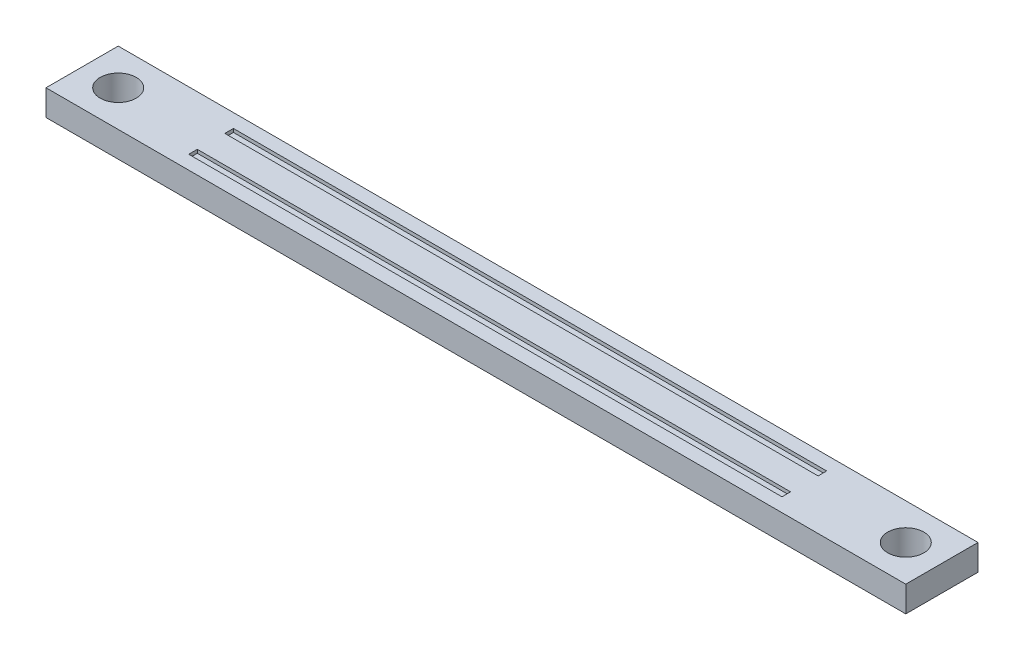
ISO-10303-21;
HEADER;
FILE_DESCRIPTION(('STEP AP214'),'2;1');
FILE_NAME('part.step','',(''),(''),'','','');
FILE_SCHEMA(('AUTOMOTIVE_DESIGN { 1 0 10303 214 1 1 1 1 }'));
ENDSEC;
DATA;
#1=APPLICATION_CONTEXT('core data for automotive mechanical design processes');
#2=APPLICATION_PROTOCOL_DEFINITION('international standard','automotive_design',2000,#1);
#3=PRODUCT_CONTEXT('',#1,'mechanical');
#4=PRODUCT('Part','Part','',(#3));
#5=PRODUCT_RELATED_PRODUCT_CATEGORY('part','',(#4));
#6=PRODUCT_DEFINITION_FORMATION('','',#4);
#7=PRODUCT_DEFINITION_CONTEXT('part definition',#1,'design');
#8=PRODUCT_DEFINITION('design','',#6,#7);
#9=PRODUCT_DEFINITION_SHAPE('','',#8);
#10=(LENGTH_UNIT() NAMED_UNIT(*) SI_UNIT(.MILLI.,.METRE.));
#11=(NAMED_UNIT(*) PLANE_ANGLE_UNIT() SI_UNIT($,.RADIAN.));
#12=(NAMED_UNIT(*) SI_UNIT($,.STERADIAN.) SOLID_ANGLE_UNIT());
#13=UNCERTAINTY_MEASURE_WITH_UNIT(LENGTH_MEASURE(1.E-05),#10,'distance_accuracy_value','');
#14=(GEOMETRIC_REPRESENTATION_CONTEXT(3) GLOBAL_UNCERTAINTY_ASSIGNED_CONTEXT((#13)) GLOBAL_UNIT_ASSIGNED_CONTEXT((#10,
#11,#12)) REPRESENTATION_CONTEXT('',''));
#15=CARTESIAN_POINT('',(0.,0.,0.));
#16=DIRECTION('',(0.,0.,1.));
#17=DIRECTION('',(1.,0.,0.));
#18=AXIS2_PLACEMENT_3D('',#15,#16,#17);
#19=CARTESIAN_POINT('',(-260.,15.,-21.));
#20=DIRECTION('',(0.,0.,1.));
#21=DIRECTION('',(1.,0.,0.));
#22=AXIS2_PLACEMENT_3D('',#19,#20,#21);
#23=PLANE('',#22);
#24=DIRECTION('',(-1.,0.,0.));
#25=VECTOR('',#24,1.);
#26=CARTESIAN_POINT('',(-260.,0.,-21.));
#27=LINE('',#26,#25);
#28=CARTESIAN_POINT('',(250.,0.,-21.));
#29=VERTEX_POINT('',#28);
#30=CARTESIAN_POINT('',(-250.,0.,-21.));
#31=VERTEX_POINT('',#30);
#32=EDGE_CURVE('E219',#29,#31,#27,.T.);
#33=ORIENTED_EDGE('',*,*,#32,.T.);
#34=DIRECTION('',(0.,1.,0.));
#35=VECTOR('',#34,1.);
#36=CARTESIAN_POINT('',(-250.,0.,-21.));
#37=LINE('',#36,#35);
#38=CARTESIAN_POINT('',(-250.,15.,-21.));
#39=VERTEX_POINT('',#38);
#40=EDGE_CURVE('E203',#31,#39,#37,.T.);
#41=ORIENTED_EDGE('',*,*,#40,.T.);
#42=DIRECTION('',(-1.,0.,0.));
#43=VECTOR('',#42,1.);
#44=CARTESIAN_POINT('',(-260.,15.,-21.));
#45=LINE('',#44,#43);
#46=CARTESIAN_POINT('',(250.,15.,-21.));
#47=VERTEX_POINT('',#46);
#48=EDGE_CURVE('E45',#47,#39,#45,.T.);
#49=ORIENTED_EDGE('',*,*,#48,.F.);
#50=DIRECTION('',(0.,1.,0.));
#51=VECTOR('',#50,1.);
#52=CARTESIAN_POINT('',(250.,0.,-21.));
#53=LINE('',#52,#51);
#54=EDGE_CURVE('E208',#29,#47,#53,.T.);
#55=ORIENTED_EDGE('',*,*,#54,.F.);
#56=EDGE_LOOP('',(#33,#41,#49,#55));
#57=FACE_BOUND('',#56,.T.);
#58=ADVANCED_FACE('F37',(#57),#23,.F.);
#59=CARTESIAN_POINT('',(-260.,15.,21.));
#60=DIRECTION('',(0.,0.,-1.));
#61=DIRECTION('',(-1.,0.,0.));
#62=AXIS2_PLACEMENT_3D('',#59,#60,#61);
#63=PLANE('',#62);
#64=DIRECTION('',(1.,0.,0.));
#65=VECTOR('',#64,1.);
#66=CARTESIAN_POINT('',(-260.,15.,21.));
#67=LINE('',#66,#65);
#68=CARTESIAN_POINT('',(-250.,15.,21.));
#69=VERTEX_POINT('',#68);
#70=CARTESIAN_POINT('',(250.,15.,21.));
#71=VERTEX_POINT('',#70);
#72=EDGE_CURVE('E11',#69,#71,#67,.T.);
#73=ORIENTED_EDGE('',*,*,#72,.F.);
#74=DIRECTION('',(0.,1.,0.));
#75=VECTOR('',#74,1.);
#76=CARTESIAN_POINT('',(-250.,0.,21.));
#77=LINE('',#76,#75);
#78=CARTESIAN_POINT('',(-250.,0.,21.));
#79=VERTEX_POINT('',#78);
#80=EDGE_CURVE('E199',#79,#69,#77,.T.);
#81=ORIENTED_EDGE('',*,*,#80,.F.);
#82=DIRECTION('',(1.,0.,0.));
#83=VECTOR('',#82,1.);
#84=CARTESIAN_POINT('',(-260.,0.,21.));
#85=LINE('',#84,#83);
#86=CARTESIAN_POINT('',(250.,0.,21.));
#87=VERTEX_POINT('',#86);
#88=EDGE_CURVE('E40',#79,#87,#85,.T.);
#89=ORIENTED_EDGE('',*,*,#88,.T.);
#90=DIRECTION('',(0.,1.,0.));
#91=VECTOR('',#90,1.);
#92=CARTESIAN_POINT('',(250.,0.,21.));
#93=LINE('',#92,#91);
#94=EDGE_CURVE('E163',#87,#71,#93,.T.);
#95=ORIENTED_EDGE('',*,*,#94,.T.);
#96=EDGE_LOOP('',(#73,#81,#89,#95));
#97=FACE_BOUND('',#96,.T.);
#98=ADVANCED_FACE('F238',(#97),#63,.F.);
#99=CARTESIAN_POINT('',(0.,15.,0.));
#100=DIRECTION('',(0.,-1.,0.));
#101=DIRECTION('',(0.,0.,-1.));
#102=AXIS2_PLACEMENT_3D('',#99,#100,#101);
#103=PLANE('',#102);
#104=DIRECTION('',(0.,0.,-1.));
#105=VECTOR('',#104,1.);
#106=CARTESIAN_POINT('',(170.,15.,0.));
#107=LINE('',#106,#105);
#108=CARTESIAN_POINT('',(170.,15.,13.));
#109=VERTEX_POINT('',#108);
#110=CARTESIAN_POINT('',(170.,15.,8.));
#111=VERTEX_POINT('',#110);
#112=EDGE_CURVE('E156',#109,#111,#107,.T.);
#113=ORIENTED_EDGE('',*,*,#112,.F.);
#114=DIRECTION('',(1.,0.,0.));
#115=VECTOR('',#114,1.);
#116=CARTESIAN_POINT('',(0.,15.,13.));
#117=LINE('',#116,#115);
#118=CARTESIAN_POINT('',(-175.,15.,13.));
#119=VERTEX_POINT('',#118);
#120=EDGE_CURVE('E53',#119,#109,#117,.T.);
#121=ORIENTED_EDGE('',*,*,#120,.F.);
#122=DIRECTION('',(0.,0.,1.));
#123=VECTOR('',#122,1.);
#124=CARTESIAN_POINT('',(-175.,15.,0.));
#125=LINE('',#124,#123);
#126=CARTESIAN_POINT('',(-175.,15.,8.));
#127=VERTEX_POINT('',#126);
#128=EDGE_CURVE('E147',#127,#119,#125,.T.);
#129=ORIENTED_EDGE('',*,*,#128,.F.);
#130=DIRECTION('',(1.,0.,0.));
#131=VECTOR('',#130,1.);
#132=CARTESIAN_POINT('',(0.,15.,8.));
#133=LINE('',#132,#131);
#134=EDGE_CURVE('E150',#127,#111,#133,.T.);
#135=ORIENTED_EDGE('',*,*,#134,.T.);
#136=EDGE_LOOP('',(#113,#121,#129,#135));
#137=FACE_BOUND('',#136,.T.);
#138=DIRECTION('',(0.,0.,-1.));
#139=VECTOR('',#138,1.);
#140=CARTESIAN_POINT('',(170.,15.,0.));
#141=LINE('',#140,#139);
#142=CARTESIAN_POINT('',(170.,15.,-7.99999999999996));
#143=VERTEX_POINT('',#142);
#144=CARTESIAN_POINT('',(170.,15.,-13.));
#145=VERTEX_POINT('',#144);
#146=EDGE_CURVE('E182',#143,#145,#141,.T.);
#147=ORIENTED_EDGE('',*,*,#146,.F.);
#148=DIRECTION('',(1.,0.,0.));
#149=VECTOR('',#148,1.);
#150=CARTESIAN_POINT('',(0.,15.,-7.99999999999996));
#151=LINE('',#150,#149);
#152=CARTESIAN_POINT('',(-175.,15.,-7.99999999999996));
#153=VERTEX_POINT('',#152);
#154=EDGE_CURVE('E61',#153,#143,#151,.T.);
#155=ORIENTED_EDGE('',*,*,#154,.F.);
#156=DIRECTION('',(0.,0.,1.));
#157=VECTOR('',#156,1.);
#158=CARTESIAN_POINT('',(-175.,15.,0.));
#159=LINE('',#158,#157);
#160=CARTESIAN_POINT('',(-175.,15.,-13.));
#161=VERTEX_POINT('',#160);
#162=EDGE_CURVE('E171',#161,#153,#159,.T.);
#163=ORIENTED_EDGE('',*,*,#162,.F.);
#164=DIRECTION('',(-1.,0.,0.));
#165=VECTOR('',#164,1.);
#166=CARTESIAN_POINT('',(0.,15.,-13.));
#167=LINE('',#166,#165);
#168=EDGE_CURVE('E185',#145,#161,#167,.T.);
#169=ORIENTED_EDGE('',*,*,#168,.F.);
#170=EDGE_LOOP('',(#147,#155,#163,#169));
#171=FACE_BOUND('',#170,.T.);
#172=CARTESIAN_POINT('',(-228.999999999999,15.,0.));
#173=DIRECTION('',(0.,1.,0.));
#174=DIRECTION('',(0.,0.,1.));
#175=AXIS2_PLACEMENT_3D('',#172,#173,#174);
#176=CIRCLE('',#175,10.5);
#177=CARTESIAN_POINT('',(-228.999999999999,15.,10.5));
#178=VERTEX_POINT('',#177);
#179=EDGE_CURVE('E220',#178,#178,#176,.T.);
#180=ORIENTED_EDGE('',*,*,#179,.F.);
#181=EDGE_LOOP('',(#180));
#182=FACE_BOUND('',#181,.T.);
#183=CARTESIAN_POINT('',(229.,15.,0.));
#184=DIRECTION('',(0.,1.,0.));
#185=DIRECTION('',(0.,0.,1.));
#186=AXIS2_PLACEMENT_3D('',#183,#184,#185);
#187=CIRCLE('',#186,10.5);
#188=CARTESIAN_POINT('',(229.,15.,10.5));
#189=VERTEX_POINT('',#188);
#190=EDGE_CURVE('E223',#189,#189,#187,.T.);
#191=ORIENTED_EDGE('',*,*,#190,.F.);
#192=EDGE_LOOP('',(#191));
#193=FACE_BOUND('',#192,.T.);
#194=ORIENTED_EDGE('',*,*,#48,.T.);
#195=DIRECTION('',(0.,0.,-1.));
#196=VECTOR('',#195,1.);
#197=CARTESIAN_POINT('',(-250.,15.,21.));
#198=LINE('',#197,#196);
#199=EDGE_CURVE('E200',#69,#39,#198,.T.);
#200=ORIENTED_EDGE('',*,*,#199,.F.);
#201=ORIENTED_EDGE('',*,*,#72,.T.);
#202=DIRECTION('',(0.,0.,1.));
#203=VECTOR('',#202,1.);
#204=CARTESIAN_POINT('',(250.,15.,21.));
#205=LINE('',#204,#203);
#206=EDGE_CURVE('E202',#47,#71,#205,.T.);
#207=ORIENTED_EDGE('',*,*,#206,.F.);
#208=EDGE_LOOP('',(#194,#200,#201,#207));
#209=FACE_BOUND('',#208,.T.);
#210=ADVANCED_FACE('F248',(#137,#171,#182,#193,#209),#103,.F.);
#211=CARTESIAN_POINT('',(0.,0.,0.));
#212=DIRECTION('',(0.,-1.,0.));
#213=DIRECTION('',(0.,0.,-1.));
#214=AXIS2_PLACEMENT_3D('',#211,#212,#213);
#215=PLANE('',#214);
#216=DIRECTION('',(0.,0.,-1.));
#217=VECTOR('',#216,1.);
#218=CARTESIAN_POINT('',(-250.,0.,21.));
#219=LINE('',#218,#217);
#220=EDGE_CURVE('E196',#79,#31,#219,.T.);
#221=ORIENTED_EDGE('',*,*,#220,.T.);
#222=ORIENTED_EDGE('',*,*,#32,.F.);
#223=DIRECTION('',(0.,0.,1.));
#224=VECTOR('',#223,1.);
#225=CARTESIAN_POINT('',(250.,0.,21.));
#226=LINE('',#225,#224);
#227=EDGE_CURVE('E210',#29,#87,#226,.T.);
#228=ORIENTED_EDGE('',*,*,#227,.T.);
#229=ORIENTED_EDGE('',*,*,#88,.F.);
#230=EDGE_LOOP('',(#221,#222,#228,#229));
#231=FACE_BOUND('',#230,.T.);
#232=CARTESIAN_POINT('',(-228.999999999999,0.,0.));
#233=DIRECTION('',(0.,1.,0.));
#234=DIRECTION('',(0.,0.,1.));
#235=AXIS2_PLACEMENT_3D('',#232,#233,#234);
#236=CIRCLE('',#235,10.5);
#237=CARTESIAN_POINT('',(-228.999999999999,0.,10.5));
#238=VERTEX_POINT('',#237);
#239=EDGE_CURVE('E216',#238,#238,#236,.T.);
#240=ORIENTED_EDGE('',*,*,#239,.T.);
#241=EDGE_LOOP('',(#240));
#242=FACE_BOUND('',#241,.T.);
#243=CARTESIAN_POINT('',(229.,0.,0.));
#244=DIRECTION('',(0.,1.,0.));
#245=DIRECTION('',(0.,0.,1.));
#246=AXIS2_PLACEMENT_3D('',#243,#244,#245);
#247=CIRCLE('',#246,10.5);
#248=CARTESIAN_POINT('',(229.,0.,10.5));
#249=VERTEX_POINT('',#248);
#250=EDGE_CURVE('E206',#249,#249,#247,.T.);
#251=ORIENTED_EDGE('',*,*,#250,.T.);
#252=EDGE_LOOP('',(#251));
#253=FACE_BOUND('',#252,.T.);
#254=ADVANCED_FACE('F240',(#231,#242,#253),#215,.T.);
#255=CARTESIAN_POINT('',(229.,0.,0.));
#256=DIRECTION('',(0.,1.,0.));
#257=DIRECTION('',(0.,0.,1.));
#258=AXIS2_PLACEMENT_3D('',#255,#256,#257);
#259=CYLINDRICAL_SURFACE('',#258,10.5);
#260=ORIENTED_EDGE('',*,*,#250,.F.);
#261=EDGE_LOOP('',(#260));
#262=FACE_BOUND('',#261,.T.);
#263=ORIENTED_EDGE('',*,*,#190,.T.);
#264=EDGE_LOOP('',(#263));
#265=FACE_BOUND('',#264,.T.);
#266=ADVANCED_FACE('F274',(#262,#265),#259,.F.);
#267=CARTESIAN_POINT('',(-228.999999999999,0.,0.));
#268=DIRECTION('',(0.,1.,0.));
#269=DIRECTION('',(0.,0.,1.));
#270=AXIS2_PLACEMENT_3D('',#267,#268,#269);
#271=CYLINDRICAL_SURFACE('',#270,10.5);
#272=ORIENTED_EDGE('',*,*,#239,.F.);
#273=EDGE_LOOP('',(#272));
#274=FACE_BOUND('',#273,.T.);
#275=ORIENTED_EDGE('',*,*,#179,.T.);
#276=EDGE_LOOP('',(#275));
#277=FACE_BOUND('',#276,.T.);
#278=ADVANCED_FACE('F260',(#274,#277),#271,.F.);
#279=CARTESIAN_POINT('',(250.,0.,21.));
#280=DIRECTION('',(-1.,0.,0.));
#281=DIRECTION('',(0.,0.,1.));
#282=AXIS2_PLACEMENT_3D('',#279,#280,#281);
#283=PLANE('',#282);
#284=ORIENTED_EDGE('',*,*,#206,.T.);
#285=ORIENTED_EDGE('',*,*,#94,.F.);
#286=ORIENTED_EDGE('',*,*,#227,.F.);
#287=ORIENTED_EDGE('',*,*,#54,.T.);
#288=EDGE_LOOP('',(#284,#285,#286,#287));
#289=FACE_BOUND('',#288,.T.);
#290=ADVANCED_FACE('F243',(#289),#283,.F.);
#291=CARTESIAN_POINT('',(-250.,0.,21.));
#292=DIRECTION('',(1.,0.,0.));
#293=DIRECTION('',(0.,0.,-1.));
#294=AXIS2_PLACEMENT_3D('',#291,#292,#293);
#295=PLANE('',#294);
#296=ORIENTED_EDGE('',*,*,#199,.T.);
#297=ORIENTED_EDGE('',*,*,#40,.F.);
#298=ORIENTED_EDGE('',*,*,#220,.F.);
#299=ORIENTED_EDGE('',*,*,#80,.T.);
#300=EDGE_LOOP('',(#296,#297,#298,#299));
#301=FACE_BOUND('',#300,.T.);
#302=ADVANCED_FACE('F250',(#301),#295,.F.);
#303=CARTESIAN_POINT('',(0.,13.,-7.99999999999996));
#304=DIRECTION('',(0.,0.,1.));
#305=DIRECTION('',(1.,0.,0.));
#306=AXIS2_PLACEMENT_3D('',#303,#304,#305);
#307=PLANE('',#306);
#308=ORIENTED_EDGE('',*,*,#154,.T.);
#309=DIRECTION('',(0.,1.,0.));
#310=VECTOR('',#309,1.);
#311=CARTESIAN_POINT('',(170.,13.,-7.99999999999996));
#312=LINE('',#311,#310);
#313=CARTESIAN_POINT('',(170.,13.,-7.99999999999996));
#314=VERTEX_POINT('',#313);
#315=EDGE_CURVE('E180',#314,#143,#312,.T.);
#316=ORIENTED_EDGE('',*,*,#315,.F.);
#317=DIRECTION('',(1.,0.,0.));
#318=VECTOR('',#317,1.);
#319=CARTESIAN_POINT('',(0.,13.,-7.99999999999996));
#320=LINE('',#319,#318);
#321=CARTESIAN_POINT('',(-175.,13.,-7.99999999999996));
#322=VERTEX_POINT('',#321);
#323=EDGE_CURVE('E167',#322,#314,#320,.T.);
#324=ORIENTED_EDGE('',*,*,#323,.F.);
#325=DIRECTION('',(0.,1.,0.));
#326=VECTOR('',#325,1.);
#327=CARTESIAN_POINT('',(-175.,13.,-7.99999999999996));
#328=LINE('',#327,#326);
#329=EDGE_CURVE('E157',#322,#153,#328,.T.);
#330=ORIENTED_EDGE('',*,*,#329,.T.);
#331=EDGE_LOOP('',(#308,#316,#324,#330));
#332=FACE_BOUND('',#331,.T.);
#333=ADVANCED_FACE('F252',(#332),#307,.F.);
#334=CARTESIAN_POINT('',(-175.,13.,0.));
#335=DIRECTION('',(-1.,0.,0.));
#336=DIRECTION('',(0.,0.,1.));
#337=AXIS2_PLACEMENT_3D('',#334,#335,#336);
#338=PLANE('',#337);
#339=ORIENTED_EDGE('',*,*,#162,.T.);
#340=ORIENTED_EDGE('',*,*,#329,.F.);
#341=DIRECTION('',(0.,0.,1.));
#342=VECTOR('',#341,1.);
#343=CARTESIAN_POINT('',(-175.,13.,0.));
#344=LINE('',#343,#342);
#345=CARTESIAN_POINT('',(-175.,13.,-13.));
#346=VERTEX_POINT('',#345);
#347=EDGE_CURVE('E177',#346,#322,#344,.T.);
#348=ORIENTED_EDGE('',*,*,#347,.F.);
#349=DIRECTION('',(0.,1.,0.));
#350=VECTOR('',#349,1.);
#351=CARTESIAN_POINT('',(-175.,13.,-13.));
#352=LINE('',#351,#350);
#353=EDGE_CURVE('E191',#346,#161,#352,.T.);
#354=ORIENTED_EDGE('',*,*,#353,.T.);
#355=EDGE_LOOP('',(#339,#340,#348,#354));
#356=FACE_BOUND('',#355,.T.);
#357=ADVANCED_FACE('F258',(#356),#338,.F.);
#358=CARTESIAN_POINT('',(0.,13.,-13.));
#359=DIRECTION('',(0.,0.,-1.));
#360=DIRECTION('',(-1.,0.,0.));
#361=AXIS2_PLACEMENT_3D('',#358,#359,#360);
#362=PLANE('',#361);
#363=ORIENTED_EDGE('',*,*,#168,.T.);
#364=ORIENTED_EDGE('',*,*,#353,.F.);
#365=DIRECTION('',(-1.,0.,0.));
#366=VECTOR('',#365,1.);
#367=CARTESIAN_POINT('',(0.,13.,-13.));
#368=LINE('',#367,#366);
#369=CARTESIAN_POINT('',(170.,13.,-13.));
#370=VERTEX_POINT('',#369);
#371=EDGE_CURVE('E174',#370,#346,#368,.T.);
#372=ORIENTED_EDGE('',*,*,#371,.F.);
#373=DIRECTION('',(0.,1.,0.));
#374=VECTOR('',#373,1.);
#375=CARTESIAN_POINT('',(170.,13.,-13.));
#376=LINE('',#375,#374);
#377=EDGE_CURVE('E193',#370,#145,#376,.T.);
#378=ORIENTED_EDGE('',*,*,#377,.T.);
#379=EDGE_LOOP('',(#363,#364,#372,#378));
#380=FACE_BOUND('',#379,.T.);
#381=ADVANCED_FACE('F325',(#380),#362,.F.);
#382=CARTESIAN_POINT('',(170.,13.,0.));
#383=DIRECTION('',(1.,0.,0.));
#384=DIRECTION('',(0.,0.,-1.));
#385=AXIS2_PLACEMENT_3D('',#382,#383,#384);
#386=PLANE('',#385);
#387=ORIENTED_EDGE('',*,*,#146,.T.);
#388=ORIENTED_EDGE('',*,*,#377,.F.);
#389=DIRECTION('',(0.,0.,-1.));
#390=VECTOR('',#389,1.);
#391=CARTESIAN_POINT('',(170.,13.,0.));
#392=LINE('',#391,#390);
#393=EDGE_CURVE('E170',#314,#370,#392,.T.);
#394=ORIENTED_EDGE('',*,*,#393,.F.);
#395=ORIENTED_EDGE('',*,*,#315,.T.);
#396=EDGE_LOOP('',(#387,#388,#394,#395));
#397=FACE_BOUND('',#396,.T.);
#398=ADVANCED_FACE('F336',(#397),#386,.F.);
#399=CARTESIAN_POINT('',(0.,13.,0.));
#400=DIRECTION('',(0.,1.,0.));
#401=DIRECTION('',(0.,0.,1.));
#402=AXIS2_PLACEMENT_3D('',#399,#400,#401);
#403=PLANE('',#402);
#404=ORIENTED_EDGE('',*,*,#323,.T.);
#405=ORIENTED_EDGE('',*,*,#393,.T.);
#406=ORIENTED_EDGE('',*,*,#371,.T.);
#407=ORIENTED_EDGE('',*,*,#347,.T.);
#408=EDGE_LOOP('',(#404,#405,#406,#407));
#409=FACE_BOUND('',#408,.T.);
#410=ADVANCED_FACE('F347',(#409),#403,.T.);
#411=CARTESIAN_POINT('',(0.,13.,13.));
#412=DIRECTION('',(0.,0.,1.));
#413=DIRECTION('',(1.,0.,0.));
#414=AXIS2_PLACEMENT_3D('',#411,#412,#413);
#415=PLANE('',#414);
#416=ORIENTED_EDGE('',*,*,#120,.T.);
#417=DIRECTION('',(0.,1.,0.));
#418=VECTOR('',#417,1.);
#419=CARTESIAN_POINT('',(170.,13.,13.));
#420=LINE('',#419,#418);
#421=CARTESIAN_POINT('',(170.,13.,13.));
#422=VERTEX_POINT('',#421);
#423=EDGE_CURVE('E125',#422,#109,#420,.T.);
#424=ORIENTED_EDGE('',*,*,#423,.F.);
#425=DIRECTION('',(1.,0.,0.));
#426=VECTOR('',#425,1.);
#427=CARTESIAN_POINT('',(0.,13.,13.));
#428=LINE('',#427,#426);
#429=CARTESIAN_POINT('',(-175.,13.,13.));
#430=VERTEX_POINT('',#429);
#431=EDGE_CURVE('E129',#430,#422,#428,.T.);
#432=ORIENTED_EDGE('',*,*,#431,.F.);
#433=DIRECTION('',(0.,1.,0.));
#434=VECTOR('',#433,1.);
#435=CARTESIAN_POINT('',(-175.,13.,13.));
#436=LINE('',#435,#434);
#437=EDGE_CURVE('E161',#430,#119,#436,.T.);
#438=ORIENTED_EDGE('',*,*,#437,.T.);
#439=EDGE_LOOP('',(#416,#424,#432,#438));
#440=FACE_BOUND('',#439,.T.);
#441=ADVANCED_FACE('F127',(#440),#415,.F.);
#442=CARTESIAN_POINT('',(-175.,13.,0.));
#443=DIRECTION('',(-1.,0.,0.));
#444=DIRECTION('',(0.,0.,1.));
#445=AXIS2_PLACEMENT_3D('',#442,#443,#444);
#446=PLANE('',#445);
#447=ORIENTED_EDGE('',*,*,#128,.T.);
#448=ORIENTED_EDGE('',*,*,#437,.F.);
#449=DIRECTION('',(0.,0.,1.));
#450=VECTOR('',#449,1.);
#451=CARTESIAN_POINT('',(-175.,13.,0.));
#452=LINE('',#451,#450);
#453=CARTESIAN_POINT('',(-175.,13.,8.));
#454=VERTEX_POINT('',#453);
#455=EDGE_CURVE('E135',#454,#430,#452,.T.);
#456=ORIENTED_EDGE('',*,*,#455,.F.);
#457=DIRECTION('',(0.,1.,0.));
#458=VECTOR('',#457,1.);
#459=CARTESIAN_POINT('',(-175.,13.,8.));
#460=LINE('',#459,#458);
#461=EDGE_CURVE('E164',#454,#127,#460,.T.);
#462=ORIENTED_EDGE('',*,*,#461,.T.);
#463=EDGE_LOOP('',(#447,#448,#456,#462));
#464=FACE_BOUND('',#463,.T.);
#465=ADVANCED_FACE('F368',(#464),#446,.F.);
#466=CARTESIAN_POINT('',(0.,13.,8.));
#467=DIRECTION('',(0.,0.,1.));
#468=DIRECTION('',(1.,0.,0.));
#469=AXIS2_PLACEMENT_3D('',#466,#467,#468);
#470=PLANE('',#469);
#471=ORIENTED_EDGE('',*,*,#134,.F.);
#472=ORIENTED_EDGE('',*,*,#461,.F.);
#473=DIRECTION('',(1.,0.,0.));
#474=VECTOR('',#473,1.);
#475=CARTESIAN_POINT('',(0.,13.,8.));
#476=LINE('',#475,#474);
#477=CARTESIAN_POINT('',(170.,13.,8.));
#478=VERTEX_POINT('',#477);
#479=EDGE_CURVE('E143',#454,#478,#476,.T.);
#480=ORIENTED_EDGE('',*,*,#479,.T.);
#481=DIRECTION('',(0.,1.,0.));
#482=VECTOR('',#481,1.);
#483=CARTESIAN_POINT('',(170.,13.,8.));
#484=LINE('',#483,#482);
#485=EDGE_CURVE('E134',#478,#111,#484,.T.);
#486=ORIENTED_EDGE('',*,*,#485,.T.);
#487=EDGE_LOOP('',(#471,#472,#480,#486));
#488=FACE_BOUND('',#487,.T.);
#489=ADVANCED_FACE('F378',(#488),#470,.T.);
#490=CARTESIAN_POINT('',(170.,13.,0.));
#491=DIRECTION('',(1.,0.,0.));
#492=DIRECTION('',(0.,0.,-1.));
#493=AXIS2_PLACEMENT_3D('',#490,#491,#492);
#494=PLANE('',#493);
#495=ORIENTED_EDGE('',*,*,#112,.T.);
#496=ORIENTED_EDGE('',*,*,#485,.F.);
#497=DIRECTION('',(0.,0.,-1.));
#498=VECTOR('',#497,1.);
#499=CARTESIAN_POINT('',(170.,13.,0.));
#500=LINE('',#499,#498);
#501=EDGE_CURVE('E139',#422,#478,#500,.T.);
#502=ORIENTED_EDGE('',*,*,#501,.F.);
#503=ORIENTED_EDGE('',*,*,#423,.T.);
#504=EDGE_LOOP('',(#495,#496,#502,#503));
#505=FACE_BOUND('',#504,.T.);
#506=ADVANCED_FACE('F140',(#505),#494,.F.);
#507=CARTESIAN_POINT('',(0.,13.,0.));
#508=DIRECTION('',(0.,1.,0.));
#509=DIRECTION('',(0.,0.,1.));
#510=AXIS2_PLACEMENT_3D('',#507,#508,#509);
#511=PLANE('',#510);
#512=ORIENTED_EDGE('',*,*,#431,.T.);
#513=ORIENTED_EDGE('',*,*,#501,.T.);
#514=ORIENTED_EDGE('',*,*,#479,.F.);
#515=ORIENTED_EDGE('',*,*,#455,.T.);
#516=EDGE_LOOP('',(#512,#513,#514,#515));
#517=FACE_BOUND('',#516,.T.);
#518=ADVANCED_FACE('F145',(#517),#511,.T.);
#519=CLOSED_SHELL('',(#58,#98,#210,#254,#266,#278,#290,#302,#333,#357,#381,#398,#410,#441,#465,
#489,#506,#518));
#520=MANIFOLD_SOLID_BREP('B2',#519);
#521=ADVANCED_BREP_SHAPE_REPRESENTATION('',(#18,#520),#14);
#522=SHAPE_DEFINITION_REPRESENTATION(#9,#521);
ENDSEC;
END-ISO-10303-21;
